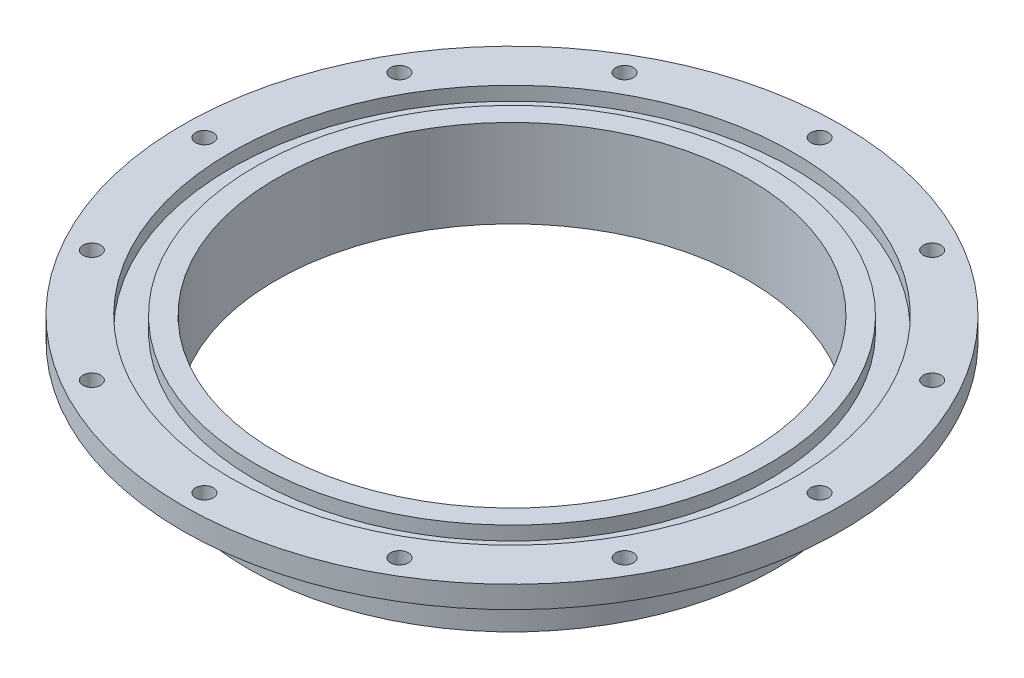
ISO-10303-21;
HEADER;
FILE_DESCRIPTION(('STEP AP214'),'2;1');
FILE_NAME('part.step','',(''),(''),'','','');
FILE_SCHEMA(('AUTOMOTIVE_DESIGN { 1 0 10303 214 1 1 1 1 }'));
ENDSEC;
DATA;
#1=APPLICATION_CONTEXT('core data for automotive mechanical design processes');
#2=APPLICATION_PROTOCOL_DEFINITION('international standard','automotive_design',2000,#1);
#3=PRODUCT_CONTEXT('',#1,'mechanical');
#4=PRODUCT('Part','Part','',(#3));
#5=PRODUCT_RELATED_PRODUCT_CATEGORY('part','',(#4));
#6=PRODUCT_DEFINITION_FORMATION('','',#4);
#7=PRODUCT_DEFINITION_CONTEXT('part definition',#1,'design');
#8=PRODUCT_DEFINITION('design','',#6,#7);
#9=PRODUCT_DEFINITION_SHAPE('','',#8);
#10=(LENGTH_UNIT() NAMED_UNIT(*) SI_UNIT(.MILLI.,.METRE.));
#11=(NAMED_UNIT(*) PLANE_ANGLE_UNIT() SI_UNIT($,.RADIAN.));
#12=(NAMED_UNIT(*) SI_UNIT($,.STERADIAN.) SOLID_ANGLE_UNIT());
#13=UNCERTAINTY_MEASURE_WITH_UNIT(LENGTH_MEASURE(1.E-05),#10,'distance_accuracy_value','');
#14=(GEOMETRIC_REPRESENTATION_CONTEXT(3) GLOBAL_UNCERTAINTY_ASSIGNED_CONTEXT((#13)) GLOBAL_UNIT_ASSIGNED_CONTEXT((#10,
#11,#12)) REPRESENTATION_CONTEXT('',''));
#15=CARTESIAN_POINT('',(0.,0.,0.));
#16=DIRECTION('',(0.,0.,1.));
#17=DIRECTION('',(1.,0.,0.));
#18=AXIS2_PLACEMENT_3D('',#15,#16,#17);
#19=CARTESIAN_POINT('',(0.,19.05,0.));
#20=DIRECTION('',(0.,-1.,0.));
#21=DIRECTION('',(0.,0.,-1.));
#22=AXIS2_PLACEMENT_3D('',#19,#20,#21);
#23=CYLINDRICAL_SURFACE('',#22,76.2);
#24=CARTESIAN_POINT('',(0.,19.05,0.));
#25=DIRECTION('',(0.,1.,0.));
#26=DIRECTION('',(0.,0.,1.));
#27=AXIS2_PLACEMENT_3D('',#24,#25,#26);
#28=CIRCLE('',#27,76.2);
#29=CARTESIAN_POINT('',(0.,19.05,-76.2));
#30=VERTEX_POINT('',#29);
#31=EDGE_CURVE('E10',#30,#30,#28,.T.);
#32=CARTESIAN_POINT('',(0.,13.1318,0.));
#33=DIRECTION('',(0.,-1.,0.));
#34=DIRECTION('',(0.,0.,-1.));
#35=AXIS2_PLACEMENT_3D('',#32,#33,#34);
#36=CIRCLE('',#35,76.2);
#37=CARTESIAN_POINT('',(0.,13.1318,-76.2));
#38=VERTEX_POINT('',#37);
#39=EDGE_CURVE('E149',#38,#38,#36,.T.);
#40=CARTESIAN_POINT('',(0.,19.05,-76.2));
#41=CARTESIAN_POINT('',(0.,18.9883520833333,-76.2));
#42=CARTESIAN_POINT('',(0.,18.9267041666667,-76.2));
#43=CARTESIAN_POINT('',(0.,18.8034083333333,-76.2));
#44=CARTESIAN_POINT('',(0.,18.7417604166667,-76.2));
#45=CARTESIAN_POINT('',(0.,18.6184645833333,-76.2));
#46=CARTESIAN_POINT('',(0.,18.5568166666667,-76.2));
#47=CARTESIAN_POINT('',(0.,18.4335208333333,-76.2));
#48=CARTESIAN_POINT('',(0.,18.3718729166667,-76.2));
#49=CARTESIAN_POINT('',(0.,18.2485770833333,-76.2));
#50=CARTESIAN_POINT('',(0.,18.1869291666667,-76.2));
#51=CARTESIAN_POINT('',(0.,18.0636333333333,-76.2));
#52=CARTESIAN_POINT('',(0.,18.0019854166667,-76.2));
#53=CARTESIAN_POINT('',(0.,17.8786895833333,-76.2));
#54=CARTESIAN_POINT('',(0.,17.8170416666667,-76.2));
#55=CARTESIAN_POINT('',(0.,17.6937458333333,-76.2));
#56=CARTESIAN_POINT('',(0.,17.6320979166667,-76.2));
#57=CARTESIAN_POINT('',(0.,17.5088020833333,-76.2));
#58=CARTESIAN_POINT('',(0.,17.4471541666667,-76.2));
#59=CARTESIAN_POINT('',(0.,17.3238583333333,-76.2));
#60=CARTESIAN_POINT('',(0.,17.2622104166667,-76.2));
#61=CARTESIAN_POINT('',(0.,17.1389145833333,-76.2));
#62=CARTESIAN_POINT('',(0.,17.0772666666667,-76.2));
#63=CARTESIAN_POINT('',(0.,16.9539708333333,-76.2));
#64=CARTESIAN_POINT('',(0.,16.8923229166667,-76.2));
#65=CARTESIAN_POINT('',(0.,16.7690270833333,-76.2));
#66=CARTESIAN_POINT('',(0.,16.7073791666667,-76.2));
#67=CARTESIAN_POINT('',(0.,16.5840833333333,-76.2));
#68=CARTESIAN_POINT('',(0.,16.5224354166667,-76.2));
#69=CARTESIAN_POINT('',(0.,16.3991395833333,-76.2));
#70=CARTESIAN_POINT('',(0.,16.3374916666667,-76.2));
#71=CARTESIAN_POINT('',(0.,16.2141958333333,-76.2));
#72=CARTESIAN_POINT('',(0.,16.1525479166667,-76.2));
#73=CARTESIAN_POINT('',(0.,16.0292520833333,-76.2));
#74=CARTESIAN_POINT('',(0.,15.9676041666667,-76.2));
#75=CARTESIAN_POINT('',(0.,15.8443083333333,-76.2));
#76=CARTESIAN_POINT('',(0.,15.7826604166667,-76.2));
#77=CARTESIAN_POINT('',(0.,15.6593645833333,-76.2));
#78=CARTESIAN_POINT('',(0.,15.5977166666667,-76.2));
#79=CARTESIAN_POINT('',(0.,15.4744208333333,-76.2));
#80=CARTESIAN_POINT('',(0.,15.4127729166667,-76.2));
#81=CARTESIAN_POINT('',(0.,15.2894770833333,-76.2));
#82=CARTESIAN_POINT('',(0.,15.2278291666667,-76.2));
#83=CARTESIAN_POINT('',(0.,15.1045333333333,-76.2));
#84=CARTESIAN_POINT('',(0.,15.0428854166667,-76.2));
#85=CARTESIAN_POINT('',(0.,14.9195895833333,-76.2));
#86=CARTESIAN_POINT('',(0.,14.8579416666667,-76.2));
#87=CARTESIAN_POINT('',(0.,14.7346458333333,-76.2));
#88=CARTESIAN_POINT('',(0.,14.6729979166667,-76.2));
#89=CARTESIAN_POINT('',(0.,14.5497020833333,-76.2));
#90=CARTESIAN_POINT('',(0.,14.4880541666667,-76.2));
#91=CARTESIAN_POINT('',(0.,14.3647583333333,-76.2));
#92=CARTESIAN_POINT('',(0.,14.3031104166667,-76.2));
#93=CARTESIAN_POINT('',(0.,14.1798145833333,-76.2));
#94=CARTESIAN_POINT('',(0.,14.1181666666667,-76.2));
#95=CARTESIAN_POINT('',(0.,13.9948708333333,-76.2));
#96=CARTESIAN_POINT('',(0.,13.9332229166667,-76.2));
#97=CARTESIAN_POINT('',(0.,13.8099270833333,-76.2));
#98=CARTESIAN_POINT('',(0.,13.7482791666667,-76.2));
#99=CARTESIAN_POINT('',(0.,13.6249833333333,-76.2));
#100=CARTESIAN_POINT('',(0.,13.5633354166667,-76.2));
#101=CARTESIAN_POINT('',(0.,13.4400395833333,-76.2));
#102=CARTESIAN_POINT('',(0.,13.3783916666667,-76.2));
#103=CARTESIAN_POINT('',(0.,13.2550958333333,-76.2));
#104=CARTESIAN_POINT('',(0.,13.1934479166667,-76.2));
#105=CARTESIAN_POINT('',(0.,13.1318,-76.2));
#106=B_SPLINE_CURVE_WITH_KNOTS('',3,(#40,#41,#42,#43,#44,#45,#46,#47,#48,#49,#50,#51,#52,#53,
#54,#55,#56,#57,#58,#59,#60,#61,#62,#63,#64,#65,#66,#67,#68,#69,#70,#71,#72,#73,#74,#75,#76,#77,
#78,#79,#80,#81,#82,#83,#84,#85,#86,#87,#88,#89,#90,#91,#92,#93,#94,#95,#96,#97,#98,#99,#100,
#101,#102,#103,#104,#105),.UNSPECIFIED.,.F.,.F.,(4,2,2,2,2,2,2,2,2,2,2,2,2,2,2,2,2,2,2,2,2,2,2,
2,2,2,2,2,2,2,2,2,4),(0.,0.184943750000003,0.369887500000002,0.554831250000002,
0.739775000000002,0.924718750000001,1.1096625,1.29460625,1.47955,1.66449375,1.8494375,
2.03438125,2.219325,2.40426875,2.5892125,2.77415625,2.9591,3.14404375,3.3289875,3.51393125,
3.698875,3.88381875,4.0687625,4.25370625,4.43865,4.62359375,4.8085375,4.99348125,5.178425,
5.36336875,5.5483125,5.73325625,5.9182),.UNSPECIFIED.);
#107=EDGE_CURVE('BSEAM35',#30,#38,#106,.T.);
#108=ORIENTED_EDGE('',*,*,#31,.F.);
#109=ORIENTED_EDGE('',*,*,#39,.F.);
#110=ORIENTED_EDGE('',*,*,#107,.T.);
#111=ORIENTED_EDGE('',*,*,#107,.F.);
#112=EDGE_LOOP('',(#108,#110,#109,#111));
#113=FACE_BOUND('',#112,.T.);
#114=ADVANCED_FACE('F35',(#113),#23,.T.);
#115=CARTESIAN_POINT('',(0.,25.4,0.));
#116=DIRECTION('',(0.,1.,0.));
#117=DIRECTION('',(0.,0.,1.));
#118=AXIS2_PLACEMENT_3D('',#115,#116,#117);
#119=PLANE('',#118);
#120=CARTESIAN_POINT('',(0.,25.4,0.));
#121=DIRECTION('',(0.,1.,0.));
#122=DIRECTION('',(0.,0.,1.));
#123=AXIS2_PLACEMENT_3D('',#120,#121,#122);
#124=CIRCLE('',#123,68.2625);
#125=CARTESIAN_POINT('',(0.,25.4,-68.2625));
#126=VERTEX_POINT('',#125);
#127=EDGE_CURVE('E54',#126,#126,#124,.T.);
#128=ORIENTED_EDGE('',*,*,#127,.F.);
#129=EDGE_LOOP('',(#128));
#130=FACE_BOUND('',#129,.T.);
#131=CARTESIAN_POINT('',(0.,25.4,0.));
#132=DIRECTION('',(0.,1.,0.));
#133=DIRECTION('',(0.,0.,1.));
#134=AXIS2_PLACEMENT_3D('',#131,#132,#133);
#135=CIRCLE('',#134,74.295);
#136=CARTESIAN_POINT('',(0.,25.4,74.295));
#137=VERTEX_POINT('',#136);
#138=EDGE_CURVE('E66',#137,#137,#135,.T.);
#139=ORIENTED_EDGE('',*,*,#138,.T.);
#140=EDGE_LOOP('',(#139));
#141=FACE_BOUND('',#140,.T.);
#142=ADVANCED_FACE('F165',(#130,#141),#119,.T.);
#143=CARTESIAN_POINT('',(0.,0.,0.));
#144=DIRECTION('',(0.,1.,0.));
#145=DIRECTION('',(0.,0.,1.));
#146=AXIS2_PLACEMENT_3D('',#143,#144,#145);
#147=PLANE('',#146);
#148=CARTESIAN_POINT('',(0.,0.,0.));
#149=DIRECTION('',(0.,1.,0.));
#150=DIRECTION('',(0.,0.,1.));
#151=AXIS2_PLACEMENT_3D('',#148,#149,#150);
#152=CIRCLE('',#151,76.2);
#153=CARTESIAN_POINT('',(0.,0.,-76.2));
#154=VERTEX_POINT('',#153);
#155=EDGE_CURVE('E39',#154,#154,#152,.T.);
#156=ORIENTED_EDGE('',*,*,#155,.F.);
#157=EDGE_LOOP('',(#156));
#158=FACE_BOUND('',#157,.T.);
#159=CARTESIAN_POINT('',(0.,0.,0.));
#160=DIRECTION('',(0.,1.,0.));
#161=DIRECTION('',(0.,0.,1.));
#162=AXIS2_PLACEMENT_3D('',#159,#160,#161);
#163=CIRCLE('',#162,68.2625);
#164=CARTESIAN_POINT('',(0.,0.,-68.2625));
#165=VERTEX_POINT('',#164);
#166=EDGE_CURVE('E46',#165,#165,#163,.T.);
#167=ORIENTED_EDGE('',*,*,#166,.T.);
#168=EDGE_LOOP('',(#167));
#169=FACE_BOUND('',#168,.T.);
#170=ADVANCED_FACE('F170',(#158,#169),#147,.F.);
#171=CARTESIAN_POINT('',(0.,5.9182,0.));
#172=DIRECTION('',(0.,-1.,0.));
#173=DIRECTION('',(0.,0.,-1.));
#174=AXIS2_PLACEMENT_3D('',#171,#172,#173);
#175=CIRCLE('',#174,76.2);
#176=CARTESIAN_POINT('',(0.,5.9182,-76.2));
#177=VERTEX_POINT('',#176);
#178=EDGE_CURVE('E139',#177,#177,#175,.T.);
#179=CARTESIAN_POINT('',(0.,5.9182,-76.2));
#180=CARTESIAN_POINT('',(0.,5.85655208333333,-76.2));
#181=CARTESIAN_POINT('',(0.,5.79490416666667,-76.2));
#182=CARTESIAN_POINT('',(0.,5.67160833333333,-76.2));
#183=CARTESIAN_POINT('',(0.,5.60996041666667,-76.2));
#184=CARTESIAN_POINT('',(0.,5.48666458333333,-76.2));
#185=CARTESIAN_POINT('',(0.,5.42501666666667,-76.2));
#186=CARTESIAN_POINT('',(0.,5.30172083333333,-76.2));
#187=CARTESIAN_POINT('',(0.,5.24007291666667,-76.2));
#188=CARTESIAN_POINT('',(0.,5.11677708333333,-76.2));
#189=CARTESIAN_POINT('',(0.,5.05512916666667,-76.2));
#190=CARTESIAN_POINT('',(0.,4.93183333333333,-76.2));
#191=CARTESIAN_POINT('',(0.,4.87018541666667,-76.2));
#192=CARTESIAN_POINT('',(0.,4.74688958333333,-76.2));
#193=CARTESIAN_POINT('',(0.,4.68524166666667,-76.2));
#194=CARTESIAN_POINT('',(0.,4.56194583333333,-76.2));
#195=CARTESIAN_POINT('',(0.,4.50029791666667,-76.2));
#196=CARTESIAN_POINT('',(0.,4.37700208333333,-76.2));
#197=CARTESIAN_POINT('',(0.,4.31535416666667,-76.2));
#198=CARTESIAN_POINT('',(0.,4.19205833333333,-76.2));
#199=CARTESIAN_POINT('',(0.,4.13041041666667,-76.2));
#200=CARTESIAN_POINT('',(0.,4.00711458333333,-76.2));
#201=CARTESIAN_POINT('',(0.,3.94546666666667,-76.2));
#202=CARTESIAN_POINT('',(0.,3.82217083333333,-76.2));
#203=CARTESIAN_POINT('',(0.,3.76052291666667,-76.2));
#204=CARTESIAN_POINT('',(0.,3.63722708333333,-76.2));
#205=CARTESIAN_POINT('',(0.,3.57557916666667,-76.2));
#206=CARTESIAN_POINT('',(0.,3.45228333333333,-76.2));
#207=CARTESIAN_POINT('',(0.,3.39063541666667,-76.2));
#208=CARTESIAN_POINT('',(0.,3.26733958333334,-76.2));
#209=CARTESIAN_POINT('',(0.,3.20569166666667,-76.2));
#210=CARTESIAN_POINT('',(0.,3.08239583333333,-76.2));
#211=CARTESIAN_POINT('',(0.,3.02074791666667,-76.2));
#212=CARTESIAN_POINT('',(0.,2.89745208333333,-76.2));
#213=CARTESIAN_POINT('',(0.,2.83580416666667,-76.2));
#214=CARTESIAN_POINT('',(0.,2.71250833333333,-76.2));
#215=CARTESIAN_POINT('',(0.,2.65086041666667,-76.2));
#216=CARTESIAN_POINT('',(0.,2.52756458333333,-76.2));
#217=CARTESIAN_POINT('',(0.,2.46591666666667,-76.2));
#218=CARTESIAN_POINT('',(0.,2.34262083333333,-76.2));
#219=CARTESIAN_POINT('',(0.,2.28097291666667,-76.2));
#220=CARTESIAN_POINT('',(0.,2.15767708333333,-76.2));
#221=CARTESIAN_POINT('',(0.,2.09602916666667,-76.2));
#222=CARTESIAN_POINT('',(0.,1.97273333333334,-76.2));
#223=CARTESIAN_POINT('',(0.,1.91108541666667,-76.2));
#224=CARTESIAN_POINT('',(0.,1.78778958333334,-76.2));
#225=CARTESIAN_POINT('',(0.,1.72614166666667,-76.2));
#226=CARTESIAN_POINT('',(0.,1.60284583333333,-76.2));
#227=CARTESIAN_POINT('',(0.,1.54119791666667,-76.2));
#228=CARTESIAN_POINT('',(0.,1.41790208333333,-76.2));
#229=CARTESIAN_POINT('',(0.,1.35625416666667,-76.2));
#230=CARTESIAN_POINT('',(0.,1.23295833333333,-76.2));
#231=CARTESIAN_POINT('',(0.,1.17131041666667,-76.2));
#232=CARTESIAN_POINT('',(0.,1.04801458333333,-76.2));
#233=CARTESIAN_POINT('',(0.,0.986366666666668,-76.2));
#234=CARTESIAN_POINT('',(0.,0.863070833333333,-76.2));
#235=CARTESIAN_POINT('',(0.,0.801422916666666,-76.2));
#236=CARTESIAN_POINT('',(0.,0.678127083333332,-76.2));
#237=CARTESIAN_POINT('',(0.,0.616479166666665,-76.2));
#238=CARTESIAN_POINT('',(0.,0.493183333333332,-76.2));
#239=CARTESIAN_POINT('',(0.,0.431535416666666,-76.2));
#240=CARTESIAN_POINT('',(0.,0.308239583333333,-76.2));
#241=CARTESIAN_POINT('',(0.,0.246591666666666,-76.2));
#242=CARTESIAN_POINT('',(0.,0.123295833333333,-76.2));
#243=CARTESIAN_POINT('',(0.,0.0616479166666666,-76.2));
#244=CARTESIAN_POINT('',(0.,0.,-76.2));
#245=B_SPLINE_CURVE_WITH_KNOTS('',3,(#179,#180,#181,#182,#183,#184,#185,#186,#187,#188,#189,
#190,#191,#192,#193,#194,#195,#196,#197,#198,#199,#200,#201,#202,#203,#204,#205,#206,#207,#208,
#209,#210,#211,#212,#213,#214,#215,#216,#217,#218,#219,#220,#221,#222,#223,#224,#225,#226,#227,
#228,#229,#230,#231,#232,#233,#234,#235,#236,#237,#238,#239,#240,#241,#242,#243,#244),
.UNSPECIFIED.,.F.,.F.,(4,2,2,2,2,2,2,2,2,2,2,2,2,2,2,2,2,2,2,2,2,2,2,2,2,2,2,2,2,2,2,2,4),(0.,
0.18494375,0.369887500000001,0.55483125,0.739775,0.924718750000001,1.1096625,1.29460625,1.47955,
1.66449375,1.8494375,2.03438125,2.219325,2.40426875,2.5892125,2.77415625,2.9591,3.14404375,
3.3289875,3.51393125,3.698875,3.88381875,4.0687625,4.25370625,4.43865,4.62359375,4.8085375,
4.99348125,5.178425,5.36336875,5.5483125,5.73325625,5.9182),.UNSPECIFIED.);
#246=EDGE_CURVE('BSEAM37',#177,#154,#245,.T.);
#247=ORIENTED_EDGE('',*,*,#178,.T.);
#248=ORIENTED_EDGE('',*,*,#155,.T.);
#249=ORIENTED_EDGE('',*,*,#246,.T.);
#250=ORIENTED_EDGE('',*,*,#246,.F.);
#251=EDGE_LOOP('',(#247,#249,#248,#250));
#252=FACE_BOUND('',#251,.T.);
#253=ADVANCED_FACE('F37',(#252),#23,.T.);
#254=CARTESIAN_POINT('',(0.,19.05,0.));
#255=DIRECTION('',(0.,-1.,0.));
#256=DIRECTION('',(0.,0.,-1.));
#257=AXIS2_PLACEMENT_3D('',#254,#255,#256);
#258=CYLINDRICAL_SURFACE('',#257,68.2625);
#259=CARTESIAN_POINT('',(0.,0.,-68.2625));
#260=CARTESIAN_POINT('',(0.,0.264583333333333,-68.2625));
#261=CARTESIAN_POINT('',(0.,0.529166666666666,-68.2625));
#262=CARTESIAN_POINT('',(0.,1.05833333333333,-68.2625));
#263=CARTESIAN_POINT('',(0.,1.32291666666667,-68.2625));
#264=CARTESIAN_POINT('',(0.,1.85208333333333,-68.2625));
#265=CARTESIAN_POINT('',(0.,2.11666666666667,-68.2625));
#266=CARTESIAN_POINT('',(0.,2.64583333333333,-68.2625));
#267=CARTESIAN_POINT('',(0.,2.91041666666667,-68.2625));
#268=CARTESIAN_POINT('',(0.,3.43958333333333,-68.2625));
#269=CARTESIAN_POINT('',(0.,3.70416666666667,-68.2625));
#270=CARTESIAN_POINT('',(0.,4.23333333333333,-68.2625));
#271=CARTESIAN_POINT('',(0.,4.49791666666667,-68.2625));
#272=CARTESIAN_POINT('',(0.,5.02708333333333,-68.2625));
#273=CARTESIAN_POINT('',(0.,5.29166666666666,-68.2625));
#274=CARTESIAN_POINT('',(0.,5.82083333333333,-68.2625));
#275=CARTESIAN_POINT('',(0.,6.08541666666666,-68.2625));
#276=CARTESIAN_POINT('',(0.,6.61458333333333,-68.2625));
#277=CARTESIAN_POINT('',(0.,6.87916666666667,-68.2625));
#278=CARTESIAN_POINT('',(0.,7.40833333333333,-68.2625));
#279=CARTESIAN_POINT('',(0.,7.67291666666667,-68.2625));
#280=CARTESIAN_POINT('',(0.,8.20208333333333,-68.2625));
#281=CARTESIAN_POINT('',(0.,8.46666666666666,-68.2625));
#282=CARTESIAN_POINT('',(0.,8.99583333333333,-68.2625));
#283=CARTESIAN_POINT('',(0.,9.26041666666666,-68.2625));
#284=CARTESIAN_POINT('',(0.,9.78958333333333,-68.2625));
#285=CARTESIAN_POINT('',(0.,10.0541666666667,-68.2625));
#286=CARTESIAN_POINT('',(0.,10.5833333333333,-68.2625));
#287=CARTESIAN_POINT('',(0.,10.8479166666667,-68.2625));
#288=CARTESIAN_POINT('',(0.,11.3770833333333,-68.2625));
#289=CARTESIAN_POINT('',(0.,11.6416666666667,-68.2625));
#290=CARTESIAN_POINT('',(0.,12.1708333333333,-68.2625));
#291=CARTESIAN_POINT('',(0.,12.4354166666667,-68.2625));
#292=CARTESIAN_POINT('',(0.,12.9645833333333,-68.2625));
#293=CARTESIAN_POINT('',(0.,13.2291666666667,-68.2625));
#294=CARTESIAN_POINT('',(0.,13.7583333333333,-68.2625));
#295=CARTESIAN_POINT('',(0.,14.0229166666667,-68.2625));
#296=CARTESIAN_POINT('',(0.,14.5520833333333,-68.2625));
#297=CARTESIAN_POINT('',(0.,14.8166666666667,-68.2625));
#298=CARTESIAN_POINT('',(0.,15.3458333333333,-68.2625));
#299=CARTESIAN_POINT('',(0.,15.6104166666667,-68.2625));
#300=CARTESIAN_POINT('',(0.,16.1395833333333,-68.2625));
#301=CARTESIAN_POINT('',(0.,16.4041666666667,-68.2625));
#302=CARTESIAN_POINT('',(0.,16.9333333333333,-68.2625));
#303=CARTESIAN_POINT('',(0.,17.1979166666667,-68.2625));
#304=CARTESIAN_POINT('',(0.,17.7270833333333,-68.2625));
#305=CARTESIAN_POINT('',(0.,17.9916666666667,-68.2625));
#306=CARTESIAN_POINT('',(0.,18.5208333333333,-68.2625));
#307=CARTESIAN_POINT('',(0.,18.7854166666667,-68.2625));
#308=CARTESIAN_POINT('',(0.,19.3145833333333,-68.2625));
#309=CARTESIAN_POINT('',(0.,19.5791666666667,-68.2625));
#310=CARTESIAN_POINT('',(0.,20.1083333333333,-68.2625));
#311=CARTESIAN_POINT('',(0.,20.3729166666667,-68.2625));
#312=CARTESIAN_POINT('',(0.,20.9020833333333,-68.2625));
#313=CARTESIAN_POINT('',(0.,21.1666666666667,-68.2625));
#314=CARTESIAN_POINT('',(0.,21.6958333333333,-68.2625));
#315=CARTESIAN_POINT('',(0.,21.9604166666667,-68.2625));
#316=CARTESIAN_POINT('',(0.,22.4895833333333,-68.2625));
#317=CARTESIAN_POINT('',(0.,22.7541666666667,-68.2625));
#318=CARTESIAN_POINT('',(0.,23.2833333333333,-68.2625));
#319=CARTESIAN_POINT('',(0.,23.5479166666667,-68.2625));
#320=CARTESIAN_POINT('',(0.,24.0770833333333,-68.2625));
#321=CARTESIAN_POINT('',(0.,24.3416666666667,-68.2625));
#322=CARTESIAN_POINT('',(0.,24.8708333333333,-68.2625));
#323=CARTESIAN_POINT('',(0.,25.1354166666667,-68.2625));
#324=CARTESIAN_POINT('',(0.,25.4,-68.2625));
#325=B_SPLINE_CURVE_WITH_KNOTS('',3,(#259,#260,#261,#262,#263,#264,#265,#266,#267,#268,#269,
#270,#271,#272,#273,#274,#275,#276,#277,#278,#279,#280,#281,#282,#283,#284,#285,#286,#287,#288,
#289,#290,#291,#292,#293,#294,#295,#296,#297,#298,#299,#300,#301,#302,#303,#304,#305,#306,#307,
#308,#309,#310,#311,#312,#313,#314,#315,#316,#317,#318,#319,#320,#321,#322,#323,#324),
.UNSPECIFIED.,.F.,.F.,(4,2,2,2,2,2,2,2,2,2,2,2,2,2,2,2,2,2,2,2,2,2,2,2,2,2,2,2,2,2,2,2,4),(0.,
0.793749999999999,1.5875,2.38125,3.175,3.96875,4.7625,5.55625,6.35,7.14375,7.9375,8.73125,9.525,
10.31875,11.1125,11.90625,12.7,13.49375,14.2875,15.08125,15.875,16.66875,17.4625,18.25625,19.05,
19.84375,20.6375,21.43125,22.225,23.01875,23.8125,24.60625,25.4),.UNSPECIFIED.);
#326=EDGE_CURVE('BSEAM175',#165,#126,#325,.T.);
#327=ORIENTED_EDGE('',*,*,#166,.F.);
#328=ORIENTED_EDGE('',*,*,#127,.T.);
#329=ORIENTED_EDGE('',*,*,#326,.T.);
#330=ORIENTED_EDGE('',*,*,#326,.F.);
#331=EDGE_LOOP('',(#327,#329,#328,#330));
#332=FACE_BOUND('',#331,.T.);
#333=ADVANCED_FACE('F175',(#332),#258,.F.);
#334=CARTESIAN_POINT('',(76.9896583964367,25.4,44.4499999999998));
#335=DIRECTION('',(0.,1.,0.));
#336=DIRECTION('',(0.86602540378444,0.,0.499999999999998));
#337=AXIS2_PLACEMENT_3D('',#334,#335,#336);
#338=CIRCLE('',#337,2.55269999999999);
#339=CARTESIAN_POINT('',(79.2003614446772,25.4,45.7263499999998));
#340=VERTEX_POINT('',#339);
#341=EDGE_CURVE('E125',#340,#340,#338,.T.);
#342=ORIENTED_EDGE('',*,*,#341,.F.);
#343=EDGE_LOOP('',(#342));
#344=FACE_BOUND('',#343,.T.);
#345=CARTESIAN_POINT('',(88.9,25.4,-3.10392691023155E-13));
#346=DIRECTION('',(0.,1.,0.));
#347=DIRECTION('',(1.,0.,0.));
#348=AXIS2_PLACEMENT_3D('',#345,#346,#347);
#349=CIRCLE('',#348,2.55269999999999);
#350=CARTESIAN_POINT('',(91.4527,25.4,-3.19305395436819E-13));
#351=VERTEX_POINT('',#350);
#352=EDGE_CURVE('E119',#351,#351,#349,.T.);
#353=ORIENTED_EDGE('',*,*,#352,.F.);
#354=EDGE_LOOP('',(#353));
#355=FACE_BOUND('',#354,.T.);
#356=CARTESIAN_POINT('',(76.9896583964364,25.4,-44.4500000000004));
#357=DIRECTION('',(0.,1.,0.));
#358=DIRECTION('',(0.866025403784436,0.,-0.500000000000004));
#359=AXIS2_PLACEMENT_3D('',#356,#357,#358);
#360=CIRCLE('',#359,2.55269999999999);
#361=CARTESIAN_POINT('',(79.2003614446769,25.4,-45.7263500000004));
#362=VERTEX_POINT('',#361);
#363=EDGE_CURVE('E113',#362,#362,#360,.T.);
#364=ORIENTED_EDGE('',*,*,#363,.F.);
#365=EDGE_LOOP('',(#364));
#366=FACE_BOUND('',#365,.T.);
#367=CARTESIAN_POINT('',(44.4499999999996,25.4,-76.9896583964369));
#368=DIRECTION('',(0.,1.,0.));
#369=DIRECTION('',(0.499999999999995,0.,-0.866025403784442));
#370=AXIS2_PLACEMENT_3D('',#367,#368,#369);
#371=CIRCLE('',#370,2.55269999999999);
#372=CARTESIAN_POINT('',(45.7263499999995,25.4,-79.2003614446774));
#373=VERTEX_POINT('',#372);
#374=EDGE_CURVE('E107',#373,#373,#371,.T.);
#375=ORIENTED_EDGE('',*,*,#374,.F.);
#376=EDGE_LOOP('',(#375));
#377=FACE_BOUND('',#376,.T.);
#378=CARTESIAN_POINT('',(0.,25.4,-88.9));
#379=DIRECTION('',(0.,1.,0.));
#380=DIRECTION('',(0.,0.,-1.));
#381=AXIS2_PLACEMENT_3D('',#378,#379,#380);
#382=CIRCLE('',#381,2.55269999999999);
#383=CARTESIAN_POINT('',(0.,25.4,-91.4527));
#384=VERTEX_POINT('',#383);
#385=EDGE_CURVE('E101',#384,#384,#382,.T.);
#386=ORIENTED_EDGE('',*,*,#385,.F.);
#387=EDGE_LOOP('',(#386));
#388=FACE_BOUND('',#387,.T.);
#389=CARTESIAN_POINT('',(-44.4500000000006,25.4,-76.9896583964362));
#390=DIRECTION('',(0.,1.,0.));
#391=DIRECTION('',(-0.500000000000007,0.,-0.866025403784435));
#392=AXIS2_PLACEMENT_3D('',#389,#390,#391);
#393=CIRCLE('',#392,2.55269999999999);
#394=CARTESIAN_POINT('',(-45.7263500000007,25.4,-79.2003614446768));
#395=VERTEX_POINT('',#394);
#396=EDGE_CURVE('E95',#395,#395,#393,.T.);
#397=ORIENTED_EDGE('',*,*,#396,.F.);
#398=EDGE_LOOP('',(#397));
#399=FACE_BOUND('',#398,.T.);
#400=CARTESIAN_POINT('',(-76.989658396437,25.4,-44.4499999999993));
#401=DIRECTION('',(0.,1.,0.));
#402=DIRECTION('',(-0.866025403784443,0.,-0.499999999999992));
#403=AXIS2_PLACEMENT_3D('',#400,#401,#402);
#404=CIRCLE('',#403,2.55269999999999);
#405=CARTESIAN_POINT('',(-79.2003614446776,25.4,-45.7263499999993));
#406=VERTEX_POINT('',#405);
#407=EDGE_CURVE('E87',#406,#406,#404,.T.);
#408=ORIENTED_EDGE('',*,*,#407,.F.);
#409=EDGE_LOOP('',(#408));
#410=FACE_BOUND('',#409,.T.);
#411=CARTESIAN_POINT('',(-88.9,25.4,9.31178073069464E-13));
#412=DIRECTION('',(0.,1.,0.));
#413=DIRECTION('',(-1.,0.,0.));
#414=AXIS2_PLACEMENT_3D('',#411,#412,#413);
#415=CIRCLE('',#414,2.55269999999999);
#416=CARTESIAN_POINT('',(-91.4527,25.4,9.57916186310458E-13));
#417=VERTEX_POINT('',#416);
#418=EDGE_CURVE('E88',#417,#417,#415,.T.);
#419=ORIENTED_EDGE('',*,*,#418,.F.);
#420=EDGE_LOOP('',(#419));
#421=FACE_BOUND('',#420,.T.);
#422=CARTESIAN_POINT('',(-76.9896583964361,25.4,44.4500000000009));
#423=DIRECTION('',(0.,1.,0.));
#424=DIRECTION('',(-0.866025403784433,0.,0.50000000000001));
#425=AXIS2_PLACEMENT_3D('',#422,#423,#424);
#426=CIRCLE('',#425,2.55269999999999);
#427=CARTESIAN_POINT('',(-79.2003614446766,25.4,45.7263500000009));
#428=VERTEX_POINT('',#427);
#429=EDGE_CURVE('E135',#428,#428,#426,.T.);
#430=ORIENTED_EDGE('',*,*,#429,.F.);
#431=EDGE_LOOP('',(#430));
#432=FACE_BOUND('',#431,.T.);
#433=CARTESIAN_POINT('',(-44.449999999999,25.4,76.9896583964372));
#434=DIRECTION('',(0.,1.,0.));
#435=DIRECTION('',(-0.499999999999989,0.,0.866025403784445));
#436=AXIS2_PLACEMENT_3D('',#433,#434,#435);
#437=CIRCLE('',#436,2.55269999999999);
#438=CARTESIAN_POINT('',(-45.726349999999,25.4,79.2003614446777));
#439=VERTEX_POINT('',#438);
#440=EDGE_CURVE('E136',#439,#439,#437,.T.);
#441=ORIENTED_EDGE('',*,*,#440,.F.);
#442=EDGE_LOOP('',(#441));
#443=FACE_BOUND('',#442,.T.);
#444=CARTESIAN_POINT('',(44.4500000000001,25.4,76.9896583964366));
#445=DIRECTION('',(0.,1.,0.));
#446=DIRECTION('',(0.500000000000001,0.,0.866025403784438));
#447=AXIS2_PLACEMENT_3D('',#444,#445,#446);
#448=CIRCLE('',#447,2.55269999999999);
#449=CARTESIAN_POINT('',(45.7263500000001,25.4,79.2003614446771));
#450=VERTEX_POINT('',#449);
#451=EDGE_CURVE('E80',#450,#450,#448,.T.);
#452=ORIENTED_EDGE('',*,*,#451,.F.);
#453=EDGE_LOOP('',(#452));
#454=FACE_BOUND('',#453,.T.);
#455=CARTESIAN_POINT('',(0.,25.4,88.9));
#456=DIRECTION('',(0.,1.,0.));
#457=DIRECTION('',(0.,0.,1.));
#458=AXIS2_PLACEMENT_3D('',#455,#456,#457);
#459=CIRCLE('',#458,2.55269999999999);
#460=CARTESIAN_POINT('',(0.,25.4,91.4527));
#461=VERTEX_POINT('',#460);
#462=EDGE_CURVE('E74',#461,#461,#459,.T.);
#463=ORIENTED_EDGE('',*,*,#462,.F.);
#464=EDGE_LOOP('',(#463));
#465=FACE_BOUND('',#464,.T.);
#466=CARTESIAN_POINT('',(0.,25.4,0.));
#467=DIRECTION('',(0.,1.,0.));
#468=DIRECTION('',(0.,0.,1.));
#469=AXIS2_PLACEMENT_3D('',#466,#467,#468);
#470=CIRCLE('',#469,81.407);
#471=CARTESIAN_POINT('',(0.,25.4,81.407));
#472=VERTEX_POINT('',#471);
#473=EDGE_CURVE('E60',#472,#472,#470,.T.);
#474=ORIENTED_EDGE('',*,*,#473,.F.);
#475=EDGE_LOOP('',(#474));
#476=FACE_BOUND('',#475,.T.);
#477=CARTESIAN_POINT('',(0.,25.4,0.));
#478=DIRECTION('',(0.,1.,0.));
#479=DIRECTION('',(0.,0.,1.));
#480=AXIS2_PLACEMENT_3D('',#477,#478,#479);
#481=CIRCLE('',#480,95.25);
#482=CARTESIAN_POINT('',(0.,25.4,95.25));
#483=VERTEX_POINT('',#482);
#484=EDGE_CURVE('E50',#483,#483,#481,.T.);
#485=ORIENTED_EDGE('',*,*,#484,.T.);
#486=EDGE_LOOP('',(#485));
#487=FACE_BOUND('',#486,.T.);
#488=ADVANCED_FACE('F173',(#344,#355,#366,#377,#388,#399,#410,#421,#432,#443,#454,#465,#476,
#487),#119,.T.);
#489=CARTESIAN_POINT('',(0.,19.05,0.));
#490=DIRECTION('',(0.,1.,0.));
#491=DIRECTION('',(0.,0.,1.));
#492=AXIS2_PLACEMENT_3D('',#489,#490,#491);
#493=PLANE('',#492);
#494=CARTESIAN_POINT('',(76.9896583964367,19.05,44.4499999999998));
#495=DIRECTION('',(0.,1.,0.));
#496=DIRECTION('',(0.,0.,1.));
#497=AXIS2_PLACEMENT_3D('',#494,#495,#496);
#498=CIRCLE('',#497,2.55269999999999);
#499=CARTESIAN_POINT('',(76.9896583964367,19.05,47.0026999999998));
#500=VERTEX_POINT('',#499);
#501=EDGE_CURVE('E83',#500,#500,#498,.F.);
#502=ORIENTED_EDGE('',*,*,#501,.F.);
#503=EDGE_LOOP('',(#502));
#504=FACE_BOUND('',#503,.T.);
#505=CARTESIAN_POINT('',(88.9,19.05,-3.10392691023155E-13));
#506=DIRECTION('',(0.,1.,0.));
#507=DIRECTION('',(0.,0.,1.));
#508=AXIS2_PLACEMENT_3D('',#505,#506,#507);
#509=CIRCLE('',#508,2.55269999999999);
#510=CARTESIAN_POINT('',(88.9,19.05,2.55269999999968));
#511=VERTEX_POINT('',#510);
#512=EDGE_CURVE('E122',#511,#511,#509,.F.);
#513=ORIENTED_EDGE('',*,*,#512,.F.);
#514=EDGE_LOOP('',(#513));
#515=FACE_BOUND('',#514,.T.);
#516=CARTESIAN_POINT('',(76.9896583964364,19.05,-44.4500000000004));
#517=DIRECTION('',(0.,1.,0.));
#518=DIRECTION('',(0.,0.,1.));
#519=AXIS2_PLACEMENT_3D('',#516,#517,#518);
#520=CIRCLE('',#519,2.55269999999999);
#521=CARTESIAN_POINT('',(76.9896583964364,19.05,-41.8973000000004));
#522=VERTEX_POINT('',#521);
#523=EDGE_CURVE('E116',#522,#522,#520,.F.);
#524=ORIENTED_EDGE('',*,*,#523,.F.);
#525=EDGE_LOOP('',(#524));
#526=FACE_BOUND('',#525,.T.);
#527=CARTESIAN_POINT('',(44.4499999999996,19.05,-76.9896583964369));
#528=DIRECTION('',(0.,1.,0.));
#529=DIRECTION('',(0.,0.,1.));
#530=AXIS2_PLACEMENT_3D('',#527,#528,#529);
#531=CIRCLE('',#530,2.55269999999999);
#532=CARTESIAN_POINT('',(44.4499999999996,19.05,-74.4369583964369));
#533=VERTEX_POINT('',#532);
#534=EDGE_CURVE('E110',#533,#533,#531,.F.);
#535=ORIENTED_EDGE('',*,*,#534,.F.);
#536=EDGE_LOOP('',(#535));
#537=FACE_BOUND('',#536,.T.);
#538=CARTESIAN_POINT('',(0.,19.05,-88.9));
#539=DIRECTION('',(0.,1.,0.));
#540=DIRECTION('',(0.,0.,1.));
#541=AXIS2_PLACEMENT_3D('',#538,#539,#540);
#542=CIRCLE('',#541,2.55269999999999);
#543=CARTESIAN_POINT('',(0.,19.05,-86.3473));
#544=VERTEX_POINT('',#543);
#545=EDGE_CURVE('E104',#544,#544,#542,.F.);
#546=ORIENTED_EDGE('',*,*,#545,.F.);
#547=EDGE_LOOP('',(#546));
#548=FACE_BOUND('',#547,.T.);
#549=CARTESIAN_POINT('',(-44.4500000000006,19.05,-76.9896583964362));
#550=DIRECTION('',(0.,1.,0.));
#551=DIRECTION('',(0.,0.,1.));
#552=AXIS2_PLACEMENT_3D('',#549,#550,#551);
#553=CIRCLE('',#552,2.55269999999999);
#554=CARTESIAN_POINT('',(-44.4500000000006,19.05,-74.4369583964363));
#555=VERTEX_POINT('',#554);
#556=EDGE_CURVE('E98',#555,#555,#553,.F.);
#557=ORIENTED_EDGE('',*,*,#556,.F.);
#558=EDGE_LOOP('',(#557));
#559=FACE_BOUND('',#558,.T.);
#560=CARTESIAN_POINT('',(-76.989658396437,19.05,-44.4499999999993));
#561=DIRECTION('',(0.,1.,0.));
#562=DIRECTION('',(0.,0.,1.));
#563=AXIS2_PLACEMENT_3D('',#560,#561,#562);
#564=CIRCLE('',#563,2.55269999999999);
#565=CARTESIAN_POINT('',(-76.989658396437,19.05,-41.8972999999993));
#566=VERTEX_POINT('',#565);
#567=EDGE_CURVE('E92',#566,#566,#564,.F.);
#568=ORIENTED_EDGE('',*,*,#567,.F.);
#569=EDGE_LOOP('',(#568));
#570=FACE_BOUND('',#569,.T.);
#571=CARTESIAN_POINT('',(-88.9,19.05,9.31178073069464E-13));
#572=DIRECTION('',(0.,1.,0.));
#573=DIRECTION('',(0.,0.,1.));
#574=AXIS2_PLACEMENT_3D('',#571,#572,#573);
#575=CIRCLE('',#574,2.55269999999999);
#576=CARTESIAN_POINT('',(-88.9,19.05,2.55270000000092));
#577=VERTEX_POINT('',#576);
#578=EDGE_CURVE('E84',#577,#577,#575,.F.);
#579=ORIENTED_EDGE('',*,*,#578,.F.);
#580=EDGE_LOOP('',(#579));
#581=FACE_BOUND('',#580,.T.);
#582=CARTESIAN_POINT('',(-76.9896583964361,19.05,44.4500000000009));
#583=DIRECTION('',(0.,1.,0.));
#584=DIRECTION('',(0.,0.,1.));
#585=AXIS2_PLACEMENT_3D('',#582,#583,#584);
#586=CIRCLE('',#585,2.55269999999999);
#587=CARTESIAN_POINT('',(-76.9896583964361,19.05,47.0027000000009));
#588=VERTEX_POINT('',#587);
#589=EDGE_CURVE('E91',#588,#588,#586,.F.);
#590=ORIENTED_EDGE('',*,*,#589,.F.);
#591=EDGE_LOOP('',(#590));
#592=FACE_BOUND('',#591,.T.);
#593=CARTESIAN_POINT('',(-44.449999999999,19.05,76.9896583964372));
#594=DIRECTION('',(0.,1.,0.));
#595=DIRECTION('',(0.,0.,1.));
#596=AXIS2_PLACEMENT_3D('',#593,#594,#595);
#597=CIRCLE('',#596,2.55269999999999);
#598=CARTESIAN_POINT('',(-44.449999999999,19.05,79.5423583964372));
#599=VERTEX_POINT('',#598);
#600=EDGE_CURVE('E132',#599,#599,#597,.F.);
#601=ORIENTED_EDGE('',*,*,#600,.F.);
#602=EDGE_LOOP('',(#601));
#603=FACE_BOUND('',#602,.T.);
#604=CARTESIAN_POINT('',(44.4500000000001,19.05,76.9896583964366));
#605=DIRECTION('',(0.,1.,0.));
#606=DIRECTION('',(0.,0.,1.));
#607=AXIS2_PLACEMENT_3D('',#604,#605,#606);
#608=CIRCLE('',#607,2.55269999999999);
#609=CARTESIAN_POINT('',(44.4500000000001,19.05,79.5423583964365));
#610=VERTEX_POINT('',#609);
#611=EDGE_CURVE('E77',#610,#610,#608,.F.);
#612=ORIENTED_EDGE('',*,*,#611,.F.);
#613=EDGE_LOOP('',(#612));
#614=FACE_BOUND('',#613,.T.);
#615=CARTESIAN_POINT('',(0.,19.05,88.9));
#616=DIRECTION('',(0.,1.,0.));
#617=DIRECTION('',(0.,0.,1.));
#618=AXIS2_PLACEMENT_3D('',#615,#616,#617);
#619=CIRCLE('',#618,2.55269999999999);
#620=CARTESIAN_POINT('',(0.,19.05,91.4527));
#621=VERTEX_POINT('',#620);
#622=EDGE_CURVE('E69',#621,#621,#619,.F.);
#623=ORIENTED_EDGE('',*,*,#622,.F.);
#624=EDGE_LOOP('',(#623));
#625=FACE_BOUND('',#624,.T.);
#626=ORIENTED_EDGE('',*,*,#31,.T.);
#627=EDGE_LOOP('',(#626));
#628=FACE_BOUND('',#627,.T.);
#629=CARTESIAN_POINT('',(0.,19.05,0.));
#630=DIRECTION('',(0.,1.,0.));
#631=DIRECTION('',(0.,0.,1.));
#632=AXIS2_PLACEMENT_3D('',#629,#630,#631);
#633=CIRCLE('',#632,95.25);
#634=CARTESIAN_POINT('',(0.,19.05,95.25));
#635=VERTEX_POINT('',#634);
#636=EDGE_CURVE('E51',#635,#635,#633,.T.);
#637=ORIENTED_EDGE('',*,*,#636,.F.);
#638=EDGE_LOOP('',(#637));
#639=FACE_BOUND('',#638,.T.);
#640=ADVANCED_FACE('F217',(#504,#515,#526,#537,#548,#559,#570,#581,#592,#603,#614,#625,#628,
#639),#493,.F.);
#641=CARTESIAN_POINT('',(0.,25.4,0.));
#642=DIRECTION('',(0.,-1.,0.));
#643=DIRECTION('',(0.,0.,-1.));
#644=AXIS2_PLACEMENT_3D('',#641,#642,#643);
#645=CYLINDRICAL_SURFACE('',#644,95.25);
#646=ORIENTED_EDGE('',*,*,#484,.F.);
#647=EDGE_LOOP('',(#646));
#648=FACE_BOUND('',#647,.T.);
#649=ORIENTED_EDGE('',*,*,#636,.T.);
#650=EDGE_LOOP('',(#649));
#651=FACE_BOUND('',#650,.T.);
#652=ADVANCED_FACE('F213',(#648,#651),#645,.T.);
#653=CARTESIAN_POINT('',(0.,21.4122,0.));
#654=DIRECTION('',(0.,1.,0.));
#655=DIRECTION('',(0.,0.,1.));
#656=AXIS2_PLACEMENT_3D('',#653,#654,#655);
#657=CYLINDRICAL_SURFACE('',#656,81.407);
#658=CARTESIAN_POINT('',(0.,21.4122,0.));
#659=DIRECTION('',(0.,1.,0.));
#660=DIRECTION('',(0.,0.,1.));
#661=AXIS2_PLACEMENT_3D('',#658,#659,#660);
#662=CIRCLE('',#661,81.407);
#663=CARTESIAN_POINT('',(0.,21.4122,81.407));
#664=VERTEX_POINT('',#663);
#665=EDGE_CURVE('E59',#664,#664,#662,.T.);
#666=ORIENTED_EDGE('',*,*,#665,.F.);
#667=EDGE_LOOP('',(#666));
#668=FACE_BOUND('',#667,.T.);
#669=ORIENTED_EDGE('',*,*,#473,.T.);
#670=EDGE_LOOP('',(#669));
#671=FACE_BOUND('',#670,.T.);
#672=ADVANCED_FACE('F207',(#668,#671),#657,.F.);
#673=CARTESIAN_POINT('',(0.,21.4122,0.));
#674=DIRECTION('',(0.,1.,0.));
#675=DIRECTION('',(0.,0.,1.));
#676=AXIS2_PLACEMENT_3D('',#673,#674,#675);
#677=PLANE('',#676);
#678=CARTESIAN_POINT('',(0.,21.4122,0.));
#679=DIRECTION('',(0.,1.,0.));
#680=DIRECTION('',(0.,0.,1.));
#681=AXIS2_PLACEMENT_3D('',#678,#679,#680);
#682=CIRCLE('',#681,74.295);
#683=CARTESIAN_POINT('',(0.,21.4122,74.295));
#684=VERTEX_POINT('',#683);
#685=EDGE_CURVE('E63',#684,#684,#682,.T.);
#686=ORIENTED_EDGE('',*,*,#685,.F.);
#687=EDGE_LOOP('',(#686));
#688=FACE_BOUND('',#687,.T.);
#689=ORIENTED_EDGE('',*,*,#665,.T.);
#690=EDGE_LOOP('',(#689));
#691=FACE_BOUND('',#690,.T.);
#692=ADVANCED_FACE('F197',(#688,#691),#677,.T.);
#693=CARTESIAN_POINT('',(0.,21.4122,0.));
#694=DIRECTION('',(0.,1.,0.));
#695=DIRECTION('',(0.,0.,1.));
#696=AXIS2_PLACEMENT_3D('',#693,#694,#695);
#697=CYLINDRICAL_SURFACE('',#696,74.295);
#698=ORIENTED_EDGE('',*,*,#685,.T.);
#699=EDGE_LOOP('',(#698));
#700=FACE_BOUND('',#699,.T.);
#701=ORIENTED_EDGE('',*,*,#138,.F.);
#702=EDGE_LOOP('',(#701));
#703=FACE_BOUND('',#702,.T.);
#704=ADVANCED_FACE('F194',(#700,#703),#697,.T.);
#705=CARTESIAN_POINT('',(0.,11.8298740786604,88.9));
#706=DIRECTION('',(0.,1.,0.));
#707=DIRECTION('',(0.,0.,1.));
#708=AXIS2_PLACEMENT_3D('',#705,#706,#707);
#709=CYLINDRICAL_SURFACE('',#708,2.55269999999999);
#710=ORIENTED_EDGE('',*,*,#622,.T.);
#711=EDGE_LOOP('',(#710));
#712=FACE_BOUND('',#711,.T.);
#713=ORIENTED_EDGE('',*,*,#462,.T.);
#714=EDGE_LOOP('',(#713));
#715=FACE_BOUND('',#714,.T.);
#716=ADVANCED_FACE('F196',(#712,#715),#709,.F.);
#717=CARTESIAN_POINT('',(44.4500000000001,11.8298740786604,76.9896583964366));
#718=DIRECTION('',(0.,1.,0.));
#719=DIRECTION('',(0.,0.,1.));
#720=AXIS2_PLACEMENT_3D('',#717,#718,#719);
#721=CYLINDRICAL_SURFACE('',#720,2.55269999999999);
#722=ORIENTED_EDGE('',*,*,#611,.T.);
#723=EDGE_LOOP('',(#722));
#724=FACE_BOUND('',#723,.T.);
#725=ORIENTED_EDGE('',*,*,#451,.T.);
#726=EDGE_LOOP('',(#725));
#727=FACE_BOUND('',#726,.T.);
#728=ADVANCED_FACE('F204',(#724,#727),#721,.F.);
#729=CARTESIAN_POINT('',(-44.449999999999,11.8298740786604,76.9896583964372));
#730=DIRECTION('',(0.,1.,0.));
#731=DIRECTION('',(0.,0.,1.));
#732=AXIS2_PLACEMENT_3D('',#729,#730,#731);
#733=CYLINDRICAL_SURFACE('',#732,2.55269999999999);
#734=ORIENTED_EDGE('',*,*,#600,.T.);
#735=EDGE_LOOP('',(#734));
#736=FACE_BOUND('',#735,.T.);
#737=ORIENTED_EDGE('',*,*,#440,.T.);
#738=EDGE_LOOP('',(#737));
#739=FACE_BOUND('',#738,.T.);
#740=ADVANCED_FACE('F273',(#736,#739),#733,.F.);
#741=CARTESIAN_POINT('',(-76.9896583964361,11.8298740786604,44.4500000000009));
#742=DIRECTION('',(0.,1.,0.));
#743=DIRECTION('',(0.,0.,1.));
#744=AXIS2_PLACEMENT_3D('',#741,#742,#743);
#745=CYLINDRICAL_SURFACE('',#744,2.55269999999999);
#746=ORIENTED_EDGE('',*,*,#589,.T.);
#747=EDGE_LOOP('',(#746));
#748=FACE_BOUND('',#747,.T.);
#749=ORIENTED_EDGE('',*,*,#429,.T.);
#750=EDGE_LOOP('',(#749));
#751=FACE_BOUND('',#750,.T.);
#752=ADVANCED_FACE('F282',(#748,#751),#745,.F.);
#753=CARTESIAN_POINT('',(-88.9,11.8298740786604,9.31178073069464E-13));
#754=DIRECTION('',(0.,1.,0.));
#755=DIRECTION('',(0.,0.,1.));
#756=AXIS2_PLACEMENT_3D('',#753,#754,#755);
#757=CYLINDRICAL_SURFACE('',#756,2.55269999999999);
#758=ORIENTED_EDGE('',*,*,#578,.T.);
#759=EDGE_LOOP('',(#758));
#760=FACE_BOUND('',#759,.T.);
#761=ORIENTED_EDGE('',*,*,#418,.T.);
#762=EDGE_LOOP('',(#761));
#763=FACE_BOUND('',#762,.T.);
#764=ADVANCED_FACE('F292',(#760,#763),#757,.F.);
#765=CARTESIAN_POINT('',(-76.989658396437,11.8298740786604,-44.4499999999993));
#766=DIRECTION('',(0.,1.,0.));
#767=DIRECTION('',(0.,0.,1.));
#768=AXIS2_PLACEMENT_3D('',#765,#766,#767);
#769=CYLINDRICAL_SURFACE('',#768,2.55269999999999);
#770=ORIENTED_EDGE('',*,*,#567,.T.);
#771=EDGE_LOOP('',(#770));
#772=FACE_BOUND('',#771,.T.);
#773=ORIENTED_EDGE('',*,*,#407,.T.);
#774=EDGE_LOOP('',(#773));
#775=FACE_BOUND('',#774,.T.);
#776=ADVANCED_FACE('F302',(#772,#775),#769,.F.);
#777=CARTESIAN_POINT('',(-44.4500000000006,11.8298740786604,-76.9896583964362));
#778=DIRECTION('',(0.,1.,0.));
#779=DIRECTION('',(0.,0.,1.));
#780=AXIS2_PLACEMENT_3D('',#777,#778,#779);
#781=CYLINDRICAL_SURFACE('',#780,2.55269999999999);
#782=ORIENTED_EDGE('',*,*,#556,.T.);
#783=EDGE_LOOP('',(#782));
#784=FACE_BOUND('',#783,.T.);
#785=ORIENTED_EDGE('',*,*,#396,.T.);
#786=EDGE_LOOP('',(#785));
#787=FACE_BOUND('',#786,.T.);
#788=ADVANCED_FACE('F312',(#784,#787),#781,.F.);
#789=CARTESIAN_POINT('',(0.,11.8298740786604,-88.9));
#790=DIRECTION('',(0.,1.,0.));
#791=DIRECTION('',(0.,0.,1.));
#792=AXIS2_PLACEMENT_3D('',#789,#790,#791);
#793=CYLINDRICAL_SURFACE('',#792,2.55269999999999);
#794=ORIENTED_EDGE('',*,*,#545,.T.);
#795=EDGE_LOOP('',(#794));
#796=FACE_BOUND('',#795,.T.);
#797=ORIENTED_EDGE('',*,*,#385,.T.);
#798=EDGE_LOOP('',(#797));
#799=FACE_BOUND('',#798,.T.);
#800=ADVANCED_FACE('F322',(#796,#799),#793,.F.);
#801=CARTESIAN_POINT('',(44.4499999999996,11.8298740786604,-76.9896583964369));
#802=DIRECTION('',(0.,1.,0.));
#803=DIRECTION('',(0.,0.,1.));
#804=AXIS2_PLACEMENT_3D('',#801,#802,#803);
#805=CYLINDRICAL_SURFACE('',#804,2.55269999999999);
#806=ORIENTED_EDGE('',*,*,#534,.T.);
#807=EDGE_LOOP('',(#806));
#808=FACE_BOUND('',#807,.T.);
#809=ORIENTED_EDGE('',*,*,#374,.T.);
#810=EDGE_LOOP('',(#809));
#811=FACE_BOUND('',#810,.T.);
#812=ADVANCED_FACE('F332',(#808,#811),#805,.F.);
#813=CARTESIAN_POINT('',(76.9896583964364,11.8298740786604,-44.4500000000004));
#814=DIRECTION('',(0.,1.,0.));
#815=DIRECTION('',(0.,0.,1.));
#816=AXIS2_PLACEMENT_3D('',#813,#814,#815);
#817=CYLINDRICAL_SURFACE('',#816,2.55269999999999);
#818=ORIENTED_EDGE('',*,*,#523,.T.);
#819=EDGE_LOOP('',(#818));
#820=FACE_BOUND('',#819,.T.);
#821=ORIENTED_EDGE('',*,*,#363,.T.);
#822=EDGE_LOOP('',(#821));
#823=FACE_BOUND('',#822,.T.);
#824=ADVANCED_FACE('F342',(#820,#823),#817,.F.);
#825=CARTESIAN_POINT('',(88.9,11.8298740786604,-3.10392691023155E-13));
#826=DIRECTION('',(0.,1.,0.));
#827=DIRECTION('',(0.,0.,1.));
#828=AXIS2_PLACEMENT_3D('',#825,#826,#827);
#829=CYLINDRICAL_SURFACE('',#828,2.55269999999999);
#830=ORIENTED_EDGE('',*,*,#512,.T.);
#831=EDGE_LOOP('',(#830));
#832=FACE_BOUND('',#831,.T.);
#833=ORIENTED_EDGE('',*,*,#352,.T.);
#834=EDGE_LOOP('',(#833));
#835=FACE_BOUND('',#834,.T.);
#836=ADVANCED_FACE('F352',(#832,#835),#829,.F.);
#837=CARTESIAN_POINT('',(76.9896583964367,11.8298740786604,44.4499999999998));
#838=DIRECTION('',(0.,1.,0.));
#839=DIRECTION('',(0.,0.,1.));
#840=AXIS2_PLACEMENT_3D('',#837,#838,#839);
#841=CYLINDRICAL_SURFACE('',#840,2.55269999999999);
#842=ORIENTED_EDGE('',*,*,#501,.T.);
#843=EDGE_LOOP('',(#842));
#844=FACE_BOUND('',#843,.T.);
#845=ORIENTED_EDGE('',*,*,#341,.T.);
#846=EDGE_LOOP('',(#845));
#847=FACE_BOUND('',#846,.T.);
#848=ADVANCED_FACE('F362',(#844,#847),#841,.F.);
#849=CARTESIAN_POINT('',(0.,5.9182,0.));
#850=DIRECTION('',(0.,-1.,0.));
#851=DIRECTION('',(0.,0.,-1.));
#852=AXIS2_PLACEMENT_3D('',#849,#850,#851);
#853=PLANE('',#852);
#854=ORIENTED_EDGE('',*,*,#178,.F.);
#855=EDGE_LOOP('',(#854));
#856=FACE_BOUND('',#855,.T.);
#857=CARTESIAN_POINT('',(0.,5.9182,0.));
#858=DIRECTION('',(0.,-1.,0.));
#859=DIRECTION('',(0.,0.,-1.));
#860=AXIS2_PLACEMENT_3D('',#857,#858,#859);
#861=CIRCLE('',#860,71.8566);
#862=CARTESIAN_POINT('',(0.,5.9182,-71.8566));
#863=VERTEX_POINT('',#862);
#864=EDGE_CURVE('E146',#863,#863,#861,.T.);
#865=ORIENTED_EDGE('',*,*,#864,.T.);
#866=EDGE_LOOP('',(#865));
#867=FACE_BOUND('',#866,.T.);
#868=ADVANCED_FACE('F371',(#856,#867),#853,.F.);
#869=CARTESIAN_POINT('',(0.,5.9182,0.));
#870=DIRECTION('',(0.,1.,0.));
#871=DIRECTION('',(0.,0.,1.));
#872=AXIS2_PLACEMENT_3D('',#869,#870,#871);
#873=CYLINDRICAL_SURFACE('',#872,71.8566);
#874=ORIENTED_EDGE('',*,*,#864,.F.);
#875=EDGE_LOOP('',(#874));
#876=FACE_BOUND('',#875,.T.);
#877=CARTESIAN_POINT('',(0.,13.1318,0.));
#878=DIRECTION('',(0.,-1.,0.));
#879=DIRECTION('',(0.,0.,-1.));
#880=AXIS2_PLACEMENT_3D('',#877,#878,#879);
#881=CIRCLE('',#880,71.8566);
#882=CARTESIAN_POINT('',(0.,13.1318,-71.8566));
#883=VERTEX_POINT('',#882);
#884=EDGE_CURVE('E152',#883,#883,#881,.T.);
#885=ORIENTED_EDGE('',*,*,#884,.T.);
#886=EDGE_LOOP('',(#885));
#887=FACE_BOUND('',#886,.T.);
#888=ADVANCED_FACE('F156',(#876,#887),#873,.T.);
#889=CARTESIAN_POINT('',(0.,13.1318,0.));
#890=DIRECTION('',(0.,-1.,0.));
#891=DIRECTION('',(0.,0.,-1.));
#892=AXIS2_PLACEMENT_3D('',#889,#890,#891);
#893=PLANE('',#892);
#894=ORIENTED_EDGE('',*,*,#884,.F.);
#895=EDGE_LOOP('',(#894));
#896=FACE_BOUND('',#895,.T.);
#897=ORIENTED_EDGE('',*,*,#39,.T.);
#898=EDGE_LOOP('',(#897));
#899=FACE_BOUND('',#898,.T.);
#900=ADVANCED_FACE('F158',(#896,#899),#893,.T.);
#901=CLOSED_SHELL('',(#114,#142,#170,#253,#333,#488,#640,#652,#672,#692,#704,#716,#728,#740,
#752,#764,#776,#788,#800,#812,#824,#836,#848,#868,#888,#900));
#902=MANIFOLD_SOLID_BREP('B2',#901);
#903=ADVANCED_BREP_SHAPE_REPRESENTATION('',(#18,#902),#14);
#904=SHAPE_DEFINITION_REPRESENTATION(#9,#903);
ENDSEC;
END-ISO-10303-21;
